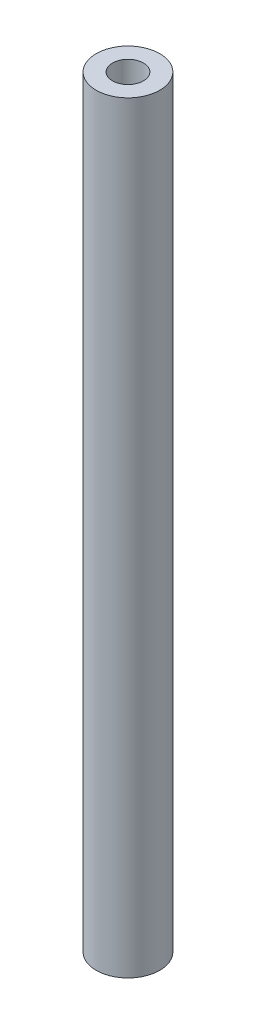
ISO-10303-21;
HEADER;
FILE_DESCRIPTION(('STEP AP214'),'2;1');
FILE_NAME('part.step','',(''),(''),'','','');
FILE_SCHEMA(('AUTOMOTIVE_DESIGN { 1 0 10303 214 1 1 1 1 }'));
ENDSEC;
DATA;
#1=APPLICATION_CONTEXT('core data for automotive mechanical design processes');
#2=APPLICATION_PROTOCOL_DEFINITION('international standard','automotive_design',2000,#1);
#3=PRODUCT_CONTEXT('',#1,'mechanical');
#4=PRODUCT('Part','Part','',(#3));
#5=PRODUCT_RELATED_PRODUCT_CATEGORY('part','',(#4));
#6=PRODUCT_DEFINITION_FORMATION('','',#4);
#7=PRODUCT_DEFINITION_CONTEXT('part definition',#1,'design');
#8=PRODUCT_DEFINITION('design','',#6,#7);
#9=PRODUCT_DEFINITION_SHAPE('','',#8);
#10=(LENGTH_UNIT() NAMED_UNIT(*) SI_UNIT(.MILLI.,.METRE.));
#11=(NAMED_UNIT(*) PLANE_ANGLE_UNIT() SI_UNIT($,.RADIAN.));
#12=(NAMED_UNIT(*) SI_UNIT($,.STERADIAN.) SOLID_ANGLE_UNIT());
#13=UNCERTAINTY_MEASURE_WITH_UNIT(LENGTH_MEASURE(1.E-05),#10,'distance_accuracy_value','');
#14=(GEOMETRIC_REPRESENTATION_CONTEXT(3) GLOBAL_UNCERTAINTY_ASSIGNED_CONTEXT((#13)) GLOBAL_UNIT_ASSIGNED_CONTEXT((#10,
#11,#12)) REPRESENTATION_CONTEXT('',''));
#15=CARTESIAN_POINT('',(0.,0.,0.));
#16=DIRECTION('',(0.,0.,1.));
#17=DIRECTION('',(1.,0.,0.));
#18=AXIS2_PLACEMENT_3D('',#15,#16,#17);
#19=CARTESIAN_POINT('',(0.,-38.1,0.));
#20=DIRECTION('',(0.,1.,0.));
#21=DIRECTION('',(0.,0.,1.));
#22=AXIS2_PLACEMENT_3D('',#19,#20,#21);
#23=CYLINDRICAL_SURFACE('',#22,1.5875);
#24=CARTESIAN_POINT('',(0.,-38.1,0.));
#25=DIRECTION('',(0.,1.,0.));
#26=DIRECTION('',(0.,0.,1.));
#27=AXIS2_PLACEMENT_3D('',#24,#25,#26);
#28=CIRCLE('',#27,1.5875);
#29=CARTESIAN_POINT('',(0.,-38.1,1.5875));
#30=VERTEX_POINT('',#29);
#31=EDGE_CURVE('E10',#30,#30,#28,.T.);
#32=CARTESIAN_POINT('',(0.,0.,0.));
#33=DIRECTION('',(0.,1.,0.));
#34=DIRECTION('',(0.,0.,1.));
#35=AXIS2_PLACEMENT_3D('',#32,#33,#34);
#36=CIRCLE('',#35,1.5875);
#37=CARTESIAN_POINT('',(0.,0.,1.5875));
#38=VERTEX_POINT('',#37);
#39=EDGE_CURVE('E34',#38,#38,#36,.T.);
#40=CARTESIAN_POINT('',(0.,-38.1,1.5875));
#41=CARTESIAN_POINT('',(0.,-37.703125,1.5875));
#42=CARTESIAN_POINT('',(0.,-37.30625,1.5875));
#43=CARTESIAN_POINT('',(0.,-36.5125,1.5875));
#44=CARTESIAN_POINT('',(0.,-36.115625,1.5875));
#45=CARTESIAN_POINT('',(0.,-35.321875,1.5875));
#46=CARTESIAN_POINT('',(0.,-34.925,1.5875));
#47=CARTESIAN_POINT('',(0.,-34.13125,1.5875));
#48=CARTESIAN_POINT('',(0.,-33.734375,1.5875));
#49=CARTESIAN_POINT('',(0.,-32.940625,1.5875));
#50=CARTESIAN_POINT('',(0.,-32.54375,1.5875));
#51=CARTESIAN_POINT('',(0.,-31.75,1.5875));
#52=CARTESIAN_POINT('',(0.,-31.353125,1.5875));
#53=CARTESIAN_POINT('',(0.,-30.559375,1.5875));
#54=CARTESIAN_POINT('',(0.,-30.1625,1.5875));
#55=CARTESIAN_POINT('',(0.,-29.36875,1.5875));
#56=CARTESIAN_POINT('',(0.,-28.971875,1.5875));
#57=CARTESIAN_POINT('',(0.,-28.178125,1.5875));
#58=CARTESIAN_POINT('',(0.,-27.78125,1.5875));
#59=CARTESIAN_POINT('',(0.,-26.9875,1.5875));
#60=CARTESIAN_POINT('',(0.,-26.590625,1.5875));
#61=CARTESIAN_POINT('',(0.,-25.796875,1.5875));
#62=CARTESIAN_POINT('',(0.,-25.4,1.5875));
#63=CARTESIAN_POINT('',(0.,-24.60625,1.5875));
#64=CARTESIAN_POINT('',(0.,-24.209375,1.5875));
#65=CARTESIAN_POINT('',(0.,-23.415625,1.5875));
#66=CARTESIAN_POINT('',(0.,-23.01875,1.5875));
#67=CARTESIAN_POINT('',(0.,-22.225,1.5875));
#68=CARTESIAN_POINT('',(0.,-21.828125,1.5875));
#69=CARTESIAN_POINT('',(0.,-21.034375,1.5875));
#70=CARTESIAN_POINT('',(0.,-20.6375,1.5875));
#71=CARTESIAN_POINT('',(0.,-19.84375,1.5875));
#72=CARTESIAN_POINT('',(0.,-19.446875,1.5875));
#73=CARTESIAN_POINT('',(0.,-18.653125,1.5875));
#74=CARTESIAN_POINT('',(0.,-18.25625,1.5875));
#75=CARTESIAN_POINT('',(0.,-17.4625,1.5875));
#76=CARTESIAN_POINT('',(0.,-17.065625,1.5875));
#77=CARTESIAN_POINT('',(0.,-16.271875,1.5875));
#78=CARTESIAN_POINT('',(0.,-15.875,1.5875));
#79=CARTESIAN_POINT('',(0.,-15.08125,1.5875));
#80=CARTESIAN_POINT('',(0.,-14.684375,1.5875));
#81=CARTESIAN_POINT('',(0.,-13.890625,1.5875));
#82=CARTESIAN_POINT('',(0.,-13.49375,1.5875));
#83=CARTESIAN_POINT('',(0.,-12.7,1.5875));
#84=CARTESIAN_POINT('',(0.,-12.303125,1.5875));
#85=CARTESIAN_POINT('',(0.,-11.509375,1.5875));
#86=CARTESIAN_POINT('',(0.,-11.1125,1.5875));
#87=CARTESIAN_POINT('',(0.,-10.31875,1.5875));
#88=CARTESIAN_POINT('',(0.,-9.921875,1.5875));
#89=CARTESIAN_POINT('',(0.,-9.128125,1.5875));
#90=CARTESIAN_POINT('',(0.,-8.73125,1.5875));
#91=CARTESIAN_POINT('',(0.,-7.9375,1.5875));
#92=CARTESIAN_POINT('',(0.,-7.540625,1.5875));
#93=CARTESIAN_POINT('',(0.,-6.746875,1.5875));
#94=CARTESIAN_POINT('',(0.,-6.35,1.5875));
#95=CARTESIAN_POINT('',(0.,-5.55625,1.5875));
#96=CARTESIAN_POINT('',(0.,-5.159375,1.5875));
#97=CARTESIAN_POINT('',(0.,-4.365625,1.5875));
#98=CARTESIAN_POINT('',(0.,-3.96875,1.5875));
#99=CARTESIAN_POINT('',(0.,-3.175,1.5875));
#100=CARTESIAN_POINT('',(0.,-2.778125,1.5875));
#101=CARTESIAN_POINT('',(0.,-1.984375,1.5875));
#102=CARTESIAN_POINT('',(0.,-1.5875,1.5875));
#103=CARTESIAN_POINT('',(0.,-0.79375,1.5875));
#104=CARTESIAN_POINT('',(0.,-0.396875,1.5875));
#105=CARTESIAN_POINT('',(0.,0.,1.5875));
#106=B_SPLINE_CURVE_WITH_KNOTS('',3,(#40,#41,#42,#43,#44,#45,#46,#47,#48,#49,#50,#51,#52,#53,
#54,#55,#56,#57,#58,#59,#60,#61,#62,#63,#64,#65,#66,#67,#68,#69,#70,#71,#72,#73,#74,#75,#76,#77,
#78,#79,#80,#81,#82,#83,#84,#85,#86,#87,#88,#89,#90,#91,#92,#93,#94,#95,#96,#97,#98,#99,#100,
#101,#102,#103,#104,#105),.UNSPECIFIED.,.F.,.F.,(4,2,2,2,2,2,2,2,2,2,2,2,2,2,2,2,2,2,2,2,2,2,2,
2,2,2,2,2,2,2,2,2,4),(0.,1.19062499999999,2.38124999999999,3.571875,4.7625,5.953125,7.14375,
8.334375,9.525,10.715625,11.90625,13.096875,14.2875,15.478125,16.66875,17.859375,19.05,
20.240625,21.43125,22.621875,23.8125,25.003125,26.19375,27.384375,28.575,29.765625,30.95625,
32.146875,33.3375,34.528125,35.71875,36.909375,38.1),.UNSPECIFIED.);
#107=EDGE_CURVE('BSEAM31',#30,#38,#106,.T.);
#108=ORIENTED_EDGE('',*,*,#31,.T.);
#109=ORIENTED_EDGE('',*,*,#39,.F.);
#110=ORIENTED_EDGE('',*,*,#107,.T.);
#111=ORIENTED_EDGE('',*,*,#107,.F.);
#112=EDGE_LOOP('',(#108,#110,#109,#111));
#113=FACE_BOUND('',#112,.T.);
#114=ADVANCED_FACE('F31',(#113),#23,.T.);
#115=CARTESIAN_POINT('',(0.,-38.1,0.));
#116=DIRECTION('',(0.,1.,0.));
#117=DIRECTION('',(0.,0.,1.));
#118=AXIS2_PLACEMENT_3D('',#115,#116,#117);
#119=PLANE('',#118);
#120=CARTESIAN_POINT('',(0.,-38.1,0.));
#121=DIRECTION('',(0.,1.,0.));
#122=DIRECTION('',(0.,0.,1.));
#123=AXIS2_PLACEMENT_3D('',#120,#121,#122);
#124=CIRCLE('',#123,0.7747);
#125=CARTESIAN_POINT('',(0.,-38.1,0.7747));
#126=VERTEX_POINT('',#125);
#127=EDGE_CURVE('E41',#126,#126,#124,.T.);
#128=ORIENTED_EDGE('',*,*,#127,.T.);
#129=EDGE_LOOP('',(#128));
#130=FACE_BOUND('',#129,.T.);
#131=ORIENTED_EDGE('',*,*,#31,.F.);
#132=EDGE_LOOP('',(#131));
#133=FACE_BOUND('',#132,.T.);
#134=ADVANCED_FACE('F49',(#130,#133),#119,.F.);
#135=CARTESIAN_POINT('',(0.,0.,0.));
#136=DIRECTION('',(0.,1.,0.));
#137=DIRECTION('',(0.,0.,1.));
#138=AXIS2_PLACEMENT_3D('',#135,#136,#137);
#139=PLANE('',#138);
#140=CARTESIAN_POINT('',(0.,0.,0.));
#141=DIRECTION('',(0.,1.,0.));
#142=DIRECTION('',(0.,0.,1.));
#143=AXIS2_PLACEMENT_3D('',#140,#141,#142);
#144=CIRCLE('',#143,0.7747);
#145=CARTESIAN_POINT('',(0.,0.,0.7747));
#146=VERTEX_POINT('',#145);
#147=EDGE_CURVE('E43',#146,#146,#144,.T.);
#148=ORIENTED_EDGE('',*,*,#147,.F.);
#149=EDGE_LOOP('',(#148));
#150=FACE_BOUND('',#149,.T.);
#151=ORIENTED_EDGE('',*,*,#39,.T.);
#152=EDGE_LOOP('',(#151));
#153=FACE_BOUND('',#152,.T.);
#154=ADVANCED_FACE('F55',(#150,#153),#139,.T.);
#155=CARTESIAN_POINT('',(0.,-38.1,0.));
#156=DIRECTION('',(0.,1.,0.));
#157=DIRECTION('',(0.,0.,1.));
#158=AXIS2_PLACEMENT_3D('',#155,#156,#157);
#159=CYLINDRICAL_SURFACE('',#158,0.7747);
#160=CARTESIAN_POINT('',(0.,-38.1,0.7747));
#161=CARTESIAN_POINT('',(0.,-37.703125,0.7747));
#162=CARTESIAN_POINT('',(0.,-37.30625,0.7747));
#163=CARTESIAN_POINT('',(0.,-36.5125,0.7747));
#164=CARTESIAN_POINT('',(0.,-36.115625,0.7747));
#165=CARTESIAN_POINT('',(0.,-35.321875,0.7747));
#166=CARTESIAN_POINT('',(0.,-34.925,0.7747));
#167=CARTESIAN_POINT('',(0.,-34.13125,0.7747));
#168=CARTESIAN_POINT('',(0.,-33.734375,0.7747));
#169=CARTESIAN_POINT('',(0.,-32.940625,0.7747));
#170=CARTESIAN_POINT('',(0.,-32.54375,0.7747));
#171=CARTESIAN_POINT('',(0.,-31.75,0.7747));
#172=CARTESIAN_POINT('',(0.,-31.353125,0.7747));
#173=CARTESIAN_POINT('',(0.,-30.559375,0.7747));
#174=CARTESIAN_POINT('',(0.,-30.1625,0.7747));
#175=CARTESIAN_POINT('',(0.,-29.36875,0.7747));
#176=CARTESIAN_POINT('',(0.,-28.971875,0.7747));
#177=CARTESIAN_POINT('',(0.,-28.178125,0.7747));
#178=CARTESIAN_POINT('',(0.,-27.78125,0.7747));
#179=CARTESIAN_POINT('',(0.,-26.9875,0.7747));
#180=CARTESIAN_POINT('',(0.,-26.590625,0.7747));
#181=CARTESIAN_POINT('',(0.,-25.796875,0.7747));
#182=CARTESIAN_POINT('',(0.,-25.4,0.7747));
#183=CARTESIAN_POINT('',(0.,-24.60625,0.7747));
#184=CARTESIAN_POINT('',(0.,-24.209375,0.7747));
#185=CARTESIAN_POINT('',(0.,-23.415625,0.7747));
#186=CARTESIAN_POINT('',(0.,-23.01875,0.7747));
#187=CARTESIAN_POINT('',(0.,-22.225,0.7747));
#188=CARTESIAN_POINT('',(0.,-21.828125,0.7747));
#189=CARTESIAN_POINT('',(0.,-21.034375,0.7747));
#190=CARTESIAN_POINT('',(0.,-20.6375,0.7747));
#191=CARTESIAN_POINT('',(0.,-19.84375,0.7747));
#192=CARTESIAN_POINT('',(0.,-19.446875,0.7747));
#193=CARTESIAN_POINT('',(0.,-18.653125,0.7747));
#194=CARTESIAN_POINT('',(0.,-18.25625,0.7747));
#195=CARTESIAN_POINT('',(0.,-17.4625,0.7747));
#196=CARTESIAN_POINT('',(0.,-17.065625,0.7747));
#197=CARTESIAN_POINT('',(0.,-16.271875,0.7747));
#198=CARTESIAN_POINT('',(0.,-15.875,0.7747));
#199=CARTESIAN_POINT('',(0.,-15.08125,0.7747));
#200=CARTESIAN_POINT('',(0.,-14.684375,0.7747));
#201=CARTESIAN_POINT('',(0.,-13.890625,0.7747));
#202=CARTESIAN_POINT('',(0.,-13.49375,0.7747));
#203=CARTESIAN_POINT('',(0.,-12.7,0.7747));
#204=CARTESIAN_POINT('',(0.,-12.303125,0.7747));
#205=CARTESIAN_POINT('',(0.,-11.509375,0.7747));
#206=CARTESIAN_POINT('',(0.,-11.1125,0.7747));
#207=CARTESIAN_POINT('',(0.,-10.31875,0.7747));
#208=CARTESIAN_POINT('',(0.,-9.921875,0.7747));
#209=CARTESIAN_POINT('',(0.,-9.128125,0.7747));
#210=CARTESIAN_POINT('',(0.,-8.73125,0.7747));
#211=CARTESIAN_POINT('',(0.,-7.9375,0.7747));
#212=CARTESIAN_POINT('',(0.,-7.540625,0.7747));
#213=CARTESIAN_POINT('',(0.,-6.746875,0.7747));
#214=CARTESIAN_POINT('',(0.,-6.35,0.7747));
#215=CARTESIAN_POINT('',(0.,-5.55625,0.7747));
#216=CARTESIAN_POINT('',(0.,-5.159375,0.7747));
#217=CARTESIAN_POINT('',(0.,-4.365625,0.7747));
#218=CARTESIAN_POINT('',(0.,-3.96875,0.7747));
#219=CARTESIAN_POINT('',(0.,-3.175,0.7747));
#220=CARTESIAN_POINT('',(0.,-2.778125,0.7747));
#221=CARTESIAN_POINT('',(0.,-1.984375,0.7747));
#222=CARTESIAN_POINT('',(0.,-1.5875,0.7747));
#223=CARTESIAN_POINT('',(0.,-0.79375,0.7747));
#224=CARTESIAN_POINT('',(0.,-0.396875,0.7747));
#225=CARTESIAN_POINT('',(0.,0.,0.7747));
#226=B_SPLINE_CURVE_WITH_KNOTS('',3,(#160,#161,#162,#163,#164,#165,#166,#167,#168,#169,#170,
#171,#172,#173,#174,#175,#176,#177,#178,#179,#180,#181,#182,#183,#184,#185,#186,#187,#188,#189,
#190,#191,#192,#193,#194,#195,#196,#197,#198,#199,#200,#201,#202,#203,#204,#205,#206,#207,#208,
#209,#210,#211,#212,#213,#214,#215,#216,#217,#218,#219,#220,#221,#222,#223,#224,#225),
.UNSPECIFIED.,.F.,.F.,(4,2,2,2,2,2,2,2,2,2,2,2,2,2,2,2,2,2,2,2,2,2,2,2,2,2,2,2,2,2,2,2,4),(0.,
1.19062499999999,2.38124999999999,3.571875,4.7625,5.953125,7.14375,8.334375,9.525,10.715625,
11.90625,13.096875,14.2875,15.478125,16.66875,17.859375,19.05,20.240625,21.43125,22.621875,
23.8125,25.003125,26.19375,27.384375,28.575,29.765625,30.95625,32.146875,33.3375,34.528125,
35.71875,36.909375,38.1),.UNSPECIFIED.);
#227=EDGE_CURVE('BSEAM52',#126,#146,#226,.T.);
#228=ORIENTED_EDGE('',*,*,#127,.F.);
#229=ORIENTED_EDGE('',*,*,#147,.T.);
#230=ORIENTED_EDGE('',*,*,#227,.T.);
#231=ORIENTED_EDGE('',*,*,#227,.F.);
#232=EDGE_LOOP('',(#228,#230,#229,#231));
#233=FACE_BOUND('',#232,.T.);
#234=ADVANCED_FACE('F52',(#233),#159,.F.);
#235=CLOSED_SHELL('',(#114,#134,#154,#234));
#236=MANIFOLD_SOLID_BREP('B2',#235);
#237=ADVANCED_BREP_SHAPE_REPRESENTATION('',(#18,#236),#14);
#238=SHAPE_DEFINITION_REPRESENTATION(#9,#237);
ENDSEC;
END-ISO-10303-21;
